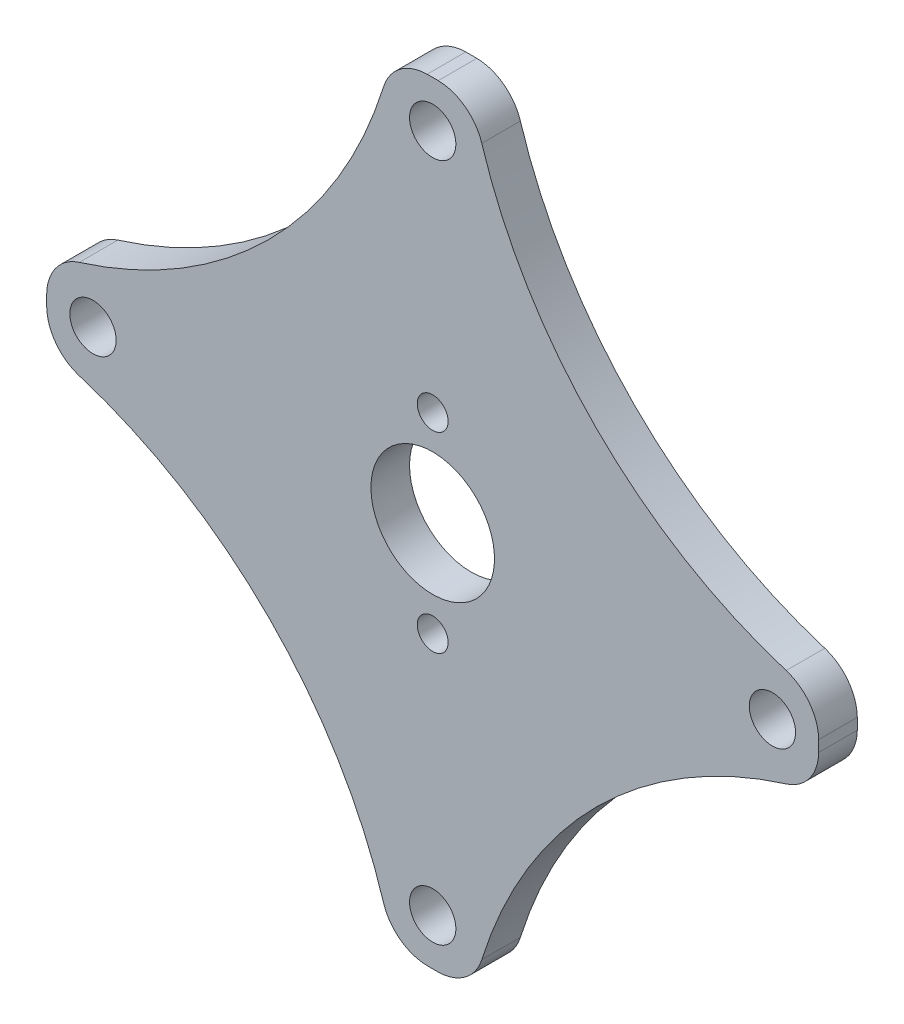
ISO-10303-21;
HEADER;
FILE_DESCRIPTION(('STEP AP214'),'2;1');
FILE_NAME('part.step','',(''),(''),'','','');
FILE_SCHEMA(('AUTOMOTIVE_DESIGN { 1 0 10303 214 1 1 1 1 }'));
ENDSEC;
DATA;
#1=APPLICATION_CONTEXT('core data for automotive mechanical design processes');
#2=APPLICATION_PROTOCOL_DEFINITION('international standard','automotive_design',2000,#1);
#3=PRODUCT_CONTEXT('',#1,'mechanical');
#4=PRODUCT('Part','Part','',(#3));
#5=PRODUCT_RELATED_PRODUCT_CATEGORY('part','',(#4));
#6=PRODUCT_DEFINITION_FORMATION('','',#4);
#7=PRODUCT_DEFINITION_CONTEXT('part definition',#1,'design');
#8=PRODUCT_DEFINITION('design','',#6,#7);
#9=PRODUCT_DEFINITION_SHAPE('','',#8);
#10=(LENGTH_UNIT() NAMED_UNIT(*) SI_UNIT(.MILLI.,.METRE.));
#11=(NAMED_UNIT(*) PLANE_ANGLE_UNIT() SI_UNIT($,.RADIAN.));
#12=(NAMED_UNIT(*) SI_UNIT($,.STERADIAN.) SOLID_ANGLE_UNIT());
#13=UNCERTAINTY_MEASURE_WITH_UNIT(LENGTH_MEASURE(1.E-05),#10,'distance_accuracy_value','');
#14=(GEOMETRIC_REPRESENTATION_CONTEXT(3) GLOBAL_UNCERTAINTY_ASSIGNED_CONTEXT((#13)) GLOBAL_UNIT_ASSIGNED_CONTEXT((#10,
#11,#12)) REPRESENTATION_CONTEXT('',''));
#15=CARTESIAN_POINT('',(0.,0.,0.));
#16=DIRECTION('',(0.,0.,1.));
#17=DIRECTION('',(1.,0.,0.));
#18=AXIS2_PLACEMENT_3D('',#15,#16,#17);
#19=CARTESIAN_POINT('',(0.,0.,2.5));
#20=DIRECTION('',(0.,0.,-1.));
#21=DIRECTION('',(-1.,0.,0.));
#22=AXIS2_PLACEMENT_3D('',#19,#20,#21);
#23=CYLINDRICAL_SURFACE('',#22,25.);
#24=CARTESIAN_POINT('',(0.,0.,2.5));
#25=DIRECTION('',(0.,0.,1.));
#26=DIRECTION('',(1.,0.,0.));
#27=AXIS2_PLACEMENT_3D('',#24,#25,#26);
#28=CIRCLE('',#27,25.);
#29=CARTESIAN_POINT('',(0.358418634758282,24.9974305896078,2.5));
#30=VERTEX_POINT('',#29);
#31=CARTESIAN_POINT('',(-0.358418634758457,24.9974305896078,2.5));
#32=VERTEX_POINT('',#31);
#33=EDGE_CURVE('E185',#30,#32,#28,.T.);
#34=ORIENTED_EDGE('',*,*,#33,.F.);
#35=DIRECTION('',(0.,0.,-1.));
#36=VECTOR('',#35,1.);
#37=CARTESIAN_POINT('',(0.358418634758282,24.9974305896078,2.5));
#38=LINE('',#37,#36);
#39=CARTESIAN_POINT('',(0.358418634758282,24.9974305896078,0.));
#40=VERTEX_POINT('',#39);
#41=EDGE_CURVE('E168',#30,#40,#38,.T.);
#42=ORIENTED_EDGE('',*,*,#41,.T.);
#43=CARTESIAN_POINT('',(0.,0.,0.));
#44=DIRECTION('',(0.,0.,1.));
#45=DIRECTION('',(1.,0.,0.));
#46=AXIS2_PLACEMENT_3D('',#43,#44,#45);
#47=CIRCLE('',#46,25.);
#48=CARTESIAN_POINT('',(-0.358418634758457,24.9974305896078,0.));
#49=VERTEX_POINT('',#48);
#50=EDGE_CURVE('E182',#40,#49,#47,.T.);
#51=ORIENTED_EDGE('',*,*,#50,.T.);
#52=DIRECTION('',(0.,0.,-1.));
#53=VECTOR('',#52,1.);
#54=CARTESIAN_POINT('',(-0.358418634758457,24.9974305896078,2.5));
#55=LINE('',#54,#53);
#56=EDGE_CURVE('E188',#49,#32,#55,.F.);
#57=ORIENTED_EDGE('',*,*,#56,.T.);
#58=EDGE_LOOP('',(#34,#42,#51,#57));
#59=FACE_BOUND('',#58,.T.);
#60=ADVANCED_FACE('F47',(#59),#23,.T.);
#61=CARTESIAN_POINT('',(-24.9974305896078,0.358418634758189,2.5));
#62=VERTEX_POINT('',#61);
#63=CARTESIAN_POINT('',(-24.9974305896078,-0.358418634758548,2.5));
#64=VERTEX_POINT('',#63);
#65=EDGE_CURVE('E381',#62,#64,#28,.T.);
#66=ORIENTED_EDGE('',*,*,#65,.F.);
#67=DIRECTION('',(0.,0.,-1.));
#68=VECTOR('',#67,1.);
#69=CARTESIAN_POINT('',(-24.9974305896078,0.358418634758189,2.5));
#70=LINE('',#69,#68);
#71=CARTESIAN_POINT('',(-24.9974305896078,0.358418634758189,0.));
#72=VERTEX_POINT('',#71);
#73=EDGE_CURVE('E363',#62,#72,#70,.T.);
#74=ORIENTED_EDGE('',*,*,#73,.T.);
#75=CARTESIAN_POINT('',(-24.9974305896078,-0.358418634758548,0.));
#76=VERTEX_POINT('',#75);
#77=EDGE_CURVE('E196',#72,#76,#47,.T.);
#78=ORIENTED_EDGE('',*,*,#77,.T.);
#79=DIRECTION('',(0.,0.,-1.));
#80=VECTOR('',#79,1.);
#81=CARTESIAN_POINT('',(-24.9974305896078,-0.358418634758548,2.5));
#82=LINE('',#81,#80);
#83=EDGE_CURVE('E359',#76,#64,#82,.F.);
#84=ORIENTED_EDGE('',*,*,#83,.T.);
#85=EDGE_LOOP('',(#66,#74,#78,#84));
#86=FACE_BOUND('',#85,.T.);
#87=ADVANCED_FACE('F418',(#86),#23,.T.);
#88=CARTESIAN_POINT('',(-0.358418634758112,-24.9974305896078,2.5));
#89=VERTEX_POINT('',#88);
#90=CARTESIAN_POINT('',(0.358418634758633,-24.9974305896078,2.5));
#91=VERTEX_POINT('',#90);
#92=EDGE_CURVE('E201',#89,#91,#28,.T.);
#93=ORIENTED_EDGE('',*,*,#92,.F.);
#94=DIRECTION('',(0.,0.,-1.));
#95=VECTOR('',#94,1.);
#96=CARTESIAN_POINT('',(-0.358418634758112,-24.9974305896078,2.5));
#97=LINE('',#96,#95);
#98=CARTESIAN_POINT('',(-0.358418634758112,-24.9974305896078,0.));
#99=VERTEX_POINT('',#98);
#100=EDGE_CURVE('E309',#89,#99,#97,.T.);
#101=ORIENTED_EDGE('',*,*,#100,.T.);
#102=CARTESIAN_POINT('',(0.358418634758633,-24.9974305896078,0.));
#103=VERTEX_POINT('',#102);
#104=EDGE_CURVE('E198',#99,#103,#47,.T.);
#105=ORIENTED_EDGE('',*,*,#104,.T.);
#106=DIRECTION('',(0.,0.,-1.));
#107=VECTOR('',#106,1.);
#108=CARTESIAN_POINT('',(0.358418634758633,-24.9974305896078,2.5));
#109=LINE('',#108,#107);
#110=EDGE_CURVE('E314',#103,#91,#109,.F.);
#111=ORIENTED_EDGE('',*,*,#110,.T.);
#112=EDGE_LOOP('',(#93,#101,#105,#111));
#113=FACE_BOUND('',#112,.T.);
#114=ADVANCED_FACE('F375',(#113),#23,.T.);
#115=CARTESIAN_POINT('',(0.,0.,2.5));
#116=DIRECTION('',(0.,0.,1.));
#117=DIRECTION('',(1.,0.,0.));
#118=AXIS2_PLACEMENT_3D('',#115,#116,#117);
#119=PLANE('',#118);
#120=CARTESIAN_POINT('',(31.8198051533946,31.8198051533947,2.5));
#121=DIRECTION('',(0.,0.,1.));
#122=DIRECTION('',(1.,0.,0.));
#123=AXIS2_PLACEMENT_3D('',#120,#121,#122);
#124=CIRCLE('',#123,30.);
#125=CARTESIAN_POINT('',(3.17944446720614,22.8906540310857,2.5));
#126=VERTEX_POINT('',#125);
#127=CARTESIAN_POINT('',(22.8906540310857,3.17944446720621,2.5));
#128=VERTEX_POINT('',#127);
#129=EDGE_CURVE('E278',#126,#128,#124,.T.);
#130=ORIENTED_EDGE('',*,*,#129,.F.);
#131=CARTESIAN_POINT('',(0.315408398587288,21.9977389188548,2.5));
#132=DIRECTION('',(0.,0.,1.));
#133=DIRECTION('',(1.,0.,0.));
#134=AXIS2_PLACEMENT_3D('',#131,#132,#133);
#135=CIRCLE('',#134,3.);
#136=EDGE_CURVE('E350',#126,#30,#135,.T.);
#137=ORIENTED_EDGE('',*,*,#136,.T.);
#138=ORIENTED_EDGE('',*,*,#33,.T.);
#139=CARTESIAN_POINT('',(-0.315408398587442,21.9977389188548,2.5));
#140=DIRECTION('',(0.,0.,1.));
#141=DIRECTION('',(1.,0.,0.));
#142=AXIS2_PLACEMENT_3D('',#139,#140,#141);
#143=CIRCLE('',#142,3.);
#144=CARTESIAN_POINT('',(-3.17944446720629,22.8906540310857,2.5));
#145=VERTEX_POINT('',#144);
#146=EDGE_CURVE('E347',#32,#145,#143,.T.);
#147=ORIENTED_EDGE('',*,*,#146,.T.);
#148=CARTESIAN_POINT('',(-31.8198051533948,31.8198051533945,2.5));
#149=DIRECTION('',(0.,0.,1.));
#150=DIRECTION('',(1.,0.,0.));
#151=AXIS2_PLACEMENT_3D('',#148,#149,#150);
#152=CIRCLE('',#151,30.);
#153=CARTESIAN_POINT('',(-22.8906540310857,3.17944446720605,2.5));
#154=VERTEX_POINT('',#153);
#155=EDGE_CURVE('E258',#154,#145,#152,.T.);
#156=ORIENTED_EDGE('',*,*,#155,.F.);
#157=CARTESIAN_POINT('',(-21.9977389188548,0.315408398587206,2.5));
#158=DIRECTION('',(0.,0.,1.));
#159=DIRECTION('',(1.,0.,0.));
#160=AXIS2_PLACEMENT_3D('',#157,#158,#159);
#161=CIRCLE('',#160,3.);
#162=EDGE_CURVE('E344',#154,#62,#161,.T.);
#163=ORIENTED_EDGE('',*,*,#162,.T.);
#164=ORIENTED_EDGE('',*,*,#65,.T.);
#165=CARTESIAN_POINT('',(-21.9977389188548,-0.315408398587522,2.5));
#166=DIRECTION('',(0.,0.,1.));
#167=DIRECTION('',(1.,0.,0.));
#168=AXIS2_PLACEMENT_3D('',#165,#166,#167);
#169=CIRCLE('',#168,3.);
#170=CARTESIAN_POINT('',(-22.8906540310857,-3.17944446720637,2.5));
#171=VERTEX_POINT('',#170);
#172=EDGE_CURVE('E341',#64,#171,#169,.T.);
#173=ORIENTED_EDGE('',*,*,#172,.T.);
#174=CARTESIAN_POINT('',(-31.8198051533944,-31.8198051533949,2.5));
#175=DIRECTION('',(0.,0.,1.));
#176=DIRECTION('',(1.,0.,0.));
#177=AXIS2_PLACEMENT_3D('',#174,#175,#176);
#178=CIRCLE('',#177,30.);
#179=CARTESIAN_POINT('',(-3.17944446720598,-22.8906540310857,2.5));
#180=VERTEX_POINT('',#179);
#181=EDGE_CURVE('E270',#180,#171,#178,.T.);
#182=ORIENTED_EDGE('',*,*,#181,.F.);
#183=CARTESIAN_POINT('',(-0.315408398587139,-21.9977389188548,2.5));
#184=DIRECTION('',(0.,0.,1.));
#185=DIRECTION('',(1.,0.,0.));
#186=AXIS2_PLACEMENT_3D('',#183,#184,#185);
#187=CIRCLE('',#186,3.);
#188=EDGE_CURVE('E338',#180,#89,#187,.T.);
#189=ORIENTED_EDGE('',*,*,#188,.T.);
#190=ORIENTED_EDGE('',*,*,#92,.T.);
#191=CARTESIAN_POINT('',(0.315408398587597,-21.9977389188548,2.5));
#192=DIRECTION('',(0.,0.,1.));
#193=DIRECTION('',(1.,0.,0.));
#194=AXIS2_PLACEMENT_3D('',#191,#192,#193);
#195=CIRCLE('',#194,3.);
#196=CARTESIAN_POINT('',(3.17944446720645,-22.8906540310857,2.5));
#197=VERTEX_POINT('',#196);
#198=EDGE_CURVE('E335',#91,#197,#195,.T.);
#199=ORIENTED_EDGE('',*,*,#198,.T.);
#200=CARTESIAN_POINT('',(31.819805153395,-31.8198051533942,2.5));
#201=DIRECTION('',(0.,0.,1.));
#202=DIRECTION('',(1.,0.,0.));
#203=AXIS2_PLACEMENT_3D('',#200,#201,#202);
#204=CIRCLE('',#203,30.);
#205=CARTESIAN_POINT('',(22.8906540310858,-3.17944446720589,2.5));
#206=VERTEX_POINT('',#205);
#207=EDGE_CURVE('E274',#206,#197,#204,.T.);
#208=ORIENTED_EDGE('',*,*,#207,.F.);
#209=CARTESIAN_POINT('',(21.9977389188548,-0.315408398587054,2.5));
#210=DIRECTION('',(0.,0.,1.));
#211=DIRECTION('',(1.,0.,0.));
#212=AXIS2_PLACEMENT_3D('',#209,#210,#211);
#213=CIRCLE('',#212,3.);
#214=CARTESIAN_POINT('',(24.9974305896078,-0.358418634758015,2.5));
#215=VERTEX_POINT('',#214);
#216=EDGE_CURVE('E71',#206,#215,#213,.T.);
#217=ORIENTED_EDGE('',*,*,#216,.T.);
#218=CARTESIAN_POINT('',(24.9974305896078,0.358418634758364,2.5));
#219=VERTEX_POINT('',#218);
#220=EDGE_CURVE('E195',#215,#219,#28,.T.);
#221=ORIENTED_EDGE('',*,*,#220,.T.);
#222=CARTESIAN_POINT('',(21.9977389188548,0.315408398587361,2.5));
#223=DIRECTION('',(0.,0.,1.));
#224=DIRECTION('',(1.,0.,0.));
#225=AXIS2_PLACEMENT_3D('',#222,#223,#224);
#226=CIRCLE('',#225,3.);
#227=EDGE_CURVE('E63',#219,#128,#226,.T.);
#228=ORIENTED_EDGE('',*,*,#227,.T.);
#229=EDGE_LOOP('',(#130,#137,#138,#147,#156,#163,#164,#173,#182,#189,#190,#199,#208,#217,#221,#228));
#230=FACE_BOUND('',#229,.T.);
#231=CARTESIAN_POINT('',(0.,6.2,2.5));
#232=DIRECTION('',(0.,0.,-1.));
#233=DIRECTION('',(-1.,0.,0.));
#234=AXIS2_PLACEMENT_3D('',#231,#232,#233);
#235=CIRCLE('',#234,1.);
#236=CARTESIAN_POINT('',(-1.,6.2,2.5));
#237=VERTEX_POINT('',#236);
#238=EDGE_CURVE('E262',#237,#237,#235,.T.);
#239=ORIENTED_EDGE('',*,*,#238,.T.);
#240=EDGE_LOOP('',(#239));
#241=FACE_BOUND('',#240,.T.);
#242=CARTESIAN_POINT('',(0.,0.,2.5));
#243=DIRECTION('',(0.,0.,-1.));
#244=DIRECTION('',(-1.,0.,0.));
#245=AXIS2_PLACEMENT_3D('',#242,#243,#244);
#246=CIRCLE('',#245,4.);
#247=CARTESIAN_POINT('',(-4.,0.,2.5));
#248=VERTEX_POINT('',#247);
#249=EDGE_CURVE('E257',#248,#248,#246,.T.);
#250=ORIENTED_EDGE('',*,*,#249,.T.);
#251=EDGE_LOOP('',(#250));
#252=FACE_BOUND('',#251,.T.);
#253=CARTESIAN_POINT('',(0.,-6.2,2.5));
#254=DIRECTION('',(0.,0.,-1.));
#255=DIRECTION('',(-1.,0.,0.));
#256=AXIS2_PLACEMENT_3D('',#253,#254,#255);
#257=CIRCLE('',#256,1.);
#258=CARTESIAN_POINT('',(-1.,-6.2,2.5));
#259=VERTEX_POINT('',#258);
#260=EDGE_CURVE('E253',#259,#259,#257,.T.);
#261=ORIENTED_EDGE('',*,*,#260,.T.);
#262=EDGE_LOOP('',(#261));
#263=FACE_BOUND('',#262,.T.);
#264=CARTESIAN_POINT('',(22.,-2.26077837006677E-12,2.5));
#265=DIRECTION('',(0.,0.,1.));
#266=DIRECTION('',(1.,0.,0.));
#267=AXIS2_PLACEMENT_3D('',#264,#265,#266);
#268=CIRCLE('',#267,1.5);
#269=CARTESIAN_POINT('',(23.5,-2.26077837006677E-12,2.5));
#270=VERTEX_POINT('',#269);
#271=EDGE_CURVE('E233',#270,#270,#268,.T.);
#272=ORIENTED_EDGE('',*,*,#271,.F.);
#273=EDGE_LOOP('',(#272));
#274=FACE_BOUND('',#273,.T.);
#275=CARTESIAN_POINT('',(0.,22.,2.5));
#276=DIRECTION('',(0.,0.,1.));
#277=DIRECTION('',(1.,0.,0.));
#278=AXIS2_PLACEMENT_3D('',#275,#276,#277);
#279=CIRCLE('',#278,1.5);
#280=CARTESIAN_POINT('',(1.5,22.,2.5));
#281=VERTEX_POINT('',#280);
#282=EDGE_CURVE('E215',#281,#281,#279,.T.);
#283=ORIENTED_EDGE('',*,*,#282,.F.);
#284=EDGE_LOOP('',(#283));
#285=FACE_BOUND('',#284,.T.);
#286=CARTESIAN_POINT('',(-22.,-2.25991100832879E-12,2.5));
#287=DIRECTION('',(0.,0.,1.));
#288=DIRECTION('',(-1.,0.,0.));
#289=AXIS2_PLACEMENT_3D('',#286,#287,#288);
#290=CIRCLE('',#289,1.5);
#291=CARTESIAN_POINT('',(-23.5,-2.25991100832879E-12,2.5));
#292=VERTEX_POINT('',#291);
#293=EDGE_CURVE('E226',#292,#292,#290,.T.);
#294=ORIENTED_EDGE('',*,*,#293,.F.);
#295=EDGE_LOOP('',(#294));
#296=FACE_BOUND('',#295,.T.);
#297=CARTESIAN_POINT('',(-4.52068937839556E-12,-22.,2.5));
#298=DIRECTION('',(0.,0.,1.));
#299=DIRECTION('',(1.,0.,0.));
#300=AXIS2_PLACEMENT_3D('',#297,#298,#299);
#301=CIRCLE('',#300,1.5);
#302=CARTESIAN_POINT('',(1.49999999999548,-22.,2.5));
#303=VERTEX_POINT('',#302);
#304=EDGE_CURVE('E241',#303,#303,#301,.T.);
#305=ORIENTED_EDGE('',*,*,#304,.F.);
#306=EDGE_LOOP('',(#305));
#307=FACE_BOUND('',#306,.T.);
#308=ADVANCED_FACE('F321',(#230,#241,#252,#263,#274,#285,#296,#307),#119,.T.);
#309=CARTESIAN_POINT('',(0.,0.,0.));
#310=DIRECTION('',(0.,0.,1.));
#311=DIRECTION('',(1.,0.,0.));
#312=AXIS2_PLACEMENT_3D('',#309,#310,#311);
#313=PLANE('',#312);
#314=CARTESIAN_POINT('',(0.,6.2,0.));
#315=DIRECTION('',(0.,0.,1.));
#316=DIRECTION('',(1.,0.,0.));
#317=AXIS2_PLACEMENT_3D('',#314,#315,#316);
#318=CIRCLE('',#317,1.);
#319=CARTESIAN_POINT('',(1.,6.2,0.));
#320=VERTEX_POINT('',#319);
#321=EDGE_CURVE('E249',#320,#320,#318,.T.);
#322=ORIENTED_EDGE('',*,*,#321,.T.);
#323=EDGE_LOOP('',(#322));
#324=FACE_BOUND('',#323,.T.);
#325=CARTESIAN_POINT('',(0.,0.,0.));
#326=DIRECTION('',(0.,0.,1.));
#327=DIRECTION('',(1.,0.,0.));
#328=AXIS2_PLACEMENT_3D('',#325,#326,#327);
#329=CIRCLE('',#328,4.);
#330=CARTESIAN_POINT('',(4.,0.,0.));
#331=VERTEX_POINT('',#330);
#332=EDGE_CURVE('E647',#331,#331,#329,.T.);
#333=ORIENTED_EDGE('',*,*,#332,.T.);
#334=EDGE_LOOP('',(#333));
#335=FACE_BOUND('',#334,.T.);
#336=CARTESIAN_POINT('',(0.,-6.2,0.));
#337=DIRECTION('',(0.,0.,1.));
#338=DIRECTION('',(1.,0.,0.));
#339=AXIS2_PLACEMENT_3D('',#336,#337,#338);
#340=CIRCLE('',#339,1.);
#341=CARTESIAN_POINT('',(1.,-6.2,0.));
#342=VERTEX_POINT('',#341);
#343=EDGE_CURVE('E266',#342,#342,#340,.T.);
#344=ORIENTED_EDGE('',*,*,#343,.T.);
#345=EDGE_LOOP('',(#344));
#346=FACE_BOUND('',#345,.T.);
#347=ORIENTED_EDGE('',*,*,#50,.F.);
#348=CARTESIAN_POINT('',(0.315408398587288,21.9977389188548,0.));
#349=DIRECTION('',(0.,0.,1.));
#350=DIRECTION('',(1.,0.,0.));
#351=AXIS2_PLACEMENT_3D('',#348,#349,#350);
#352=CIRCLE('',#351,3.);
#353=CARTESIAN_POINT('',(3.17944446720614,22.8906540310857,0.));
#354=VERTEX_POINT('',#353);
#355=EDGE_CURVE('E164',#40,#354,#352,.F.);
#356=ORIENTED_EDGE('',*,*,#355,.T.);
#357=CARTESIAN_POINT('',(31.8198051533946,31.8198051533947,0.));
#358=DIRECTION('',(0.,0.,-1.));
#359=DIRECTION('',(-1.,0.,0.));
#360=AXIS2_PLACEMENT_3D('',#357,#358,#359);
#361=CIRCLE('',#360,30.);
#362=CARTESIAN_POINT('',(22.8906540310857,3.17944446720621,0.));
#363=VERTEX_POINT('',#362);
#364=EDGE_CURVE('E282',#363,#354,#361,.T.);
#365=ORIENTED_EDGE('',*,*,#364,.F.);
#366=CARTESIAN_POINT('',(21.9977389188548,0.315408398587361,0.));
#367=DIRECTION('',(0.,0.,1.));
#368=DIRECTION('',(1.,0.,0.));
#369=AXIS2_PLACEMENT_3D('',#366,#367,#368);
#370=CIRCLE('',#369,3.);
#371=CARTESIAN_POINT('',(24.9974305896078,0.358418634758364,0.));
#372=VERTEX_POINT('',#371);
#373=EDGE_CURVE('E187',#363,#372,#370,.F.);
#374=ORIENTED_EDGE('',*,*,#373,.T.);
#375=CARTESIAN_POINT('',(24.9974305896078,-0.358418634758015,0.));
#376=VERTEX_POINT('',#375);
#377=EDGE_CURVE('E204',#376,#372,#47,.T.);
#378=ORIENTED_EDGE('',*,*,#377,.F.);
#379=CARTESIAN_POINT('',(21.9977389188548,-0.315408398587054,0.));
#380=DIRECTION('',(0.,0.,1.));
#381=DIRECTION('',(1.,0.,0.));
#382=AXIS2_PLACEMENT_3D('',#379,#380,#381);
#383=CIRCLE('',#382,3.);
#384=CARTESIAN_POINT('',(22.8906540310858,-3.17944446720589,0.));
#385=VERTEX_POINT('',#384);
#386=EDGE_CURVE('E307',#376,#385,#383,.F.);
#387=ORIENTED_EDGE('',*,*,#386,.T.);
#388=CARTESIAN_POINT('',(31.819805153395,-31.8198051533942,0.));
#389=DIRECTION('',(0.,0.,-1.));
#390=DIRECTION('',(-1.,0.,0.));
#391=AXIS2_PLACEMENT_3D('',#388,#389,#390);
#392=CIRCLE('',#391,30.);
#393=CARTESIAN_POINT('',(3.17944446720645,-22.8906540310857,0.));
#394=VERTEX_POINT('',#393);
#395=EDGE_CURVE('E285',#394,#385,#392,.T.);
#396=ORIENTED_EDGE('',*,*,#395,.F.);
#397=CARTESIAN_POINT('',(0.315408398587597,-21.9977389188548,0.));
#398=DIRECTION('',(0.,0.,1.));
#399=DIRECTION('',(1.,0.,0.));
#400=AXIS2_PLACEMENT_3D('',#397,#398,#399);
#401=CIRCLE('',#400,3.);
#402=EDGE_CURVE('E395',#394,#103,#401,.F.);
#403=ORIENTED_EDGE('',*,*,#402,.T.);
#404=ORIENTED_EDGE('',*,*,#104,.F.);
#405=CARTESIAN_POINT('',(-0.315408398587139,-21.9977389188548,0.));
#406=DIRECTION('',(0.,0.,1.));
#407=DIRECTION('',(1.,0.,0.));
#408=AXIS2_PLACEMENT_3D('',#405,#406,#407);
#409=CIRCLE('',#408,3.);
#410=CARTESIAN_POINT('',(-3.17944446720598,-22.8906540310857,0.));
#411=VERTEX_POINT('',#410);
#412=EDGE_CURVE('E398',#99,#411,#409,.F.);
#413=ORIENTED_EDGE('',*,*,#412,.T.);
#414=CARTESIAN_POINT('',(-31.8198051533944,-31.8198051533949,0.));
#415=DIRECTION('',(0.,0.,-1.));
#416=DIRECTION('',(-1.,0.,0.));
#417=AXIS2_PLACEMENT_3D('',#414,#415,#416);
#418=CIRCLE('',#417,30.);
#419=CARTESIAN_POINT('',(-22.8906540310857,-3.17944446720637,0.));
#420=VERTEX_POINT('',#419);
#421=EDGE_CURVE('E290',#420,#411,#418,.T.);
#422=ORIENTED_EDGE('',*,*,#421,.F.);
#423=CARTESIAN_POINT('',(-21.9977389188548,-0.315408398587522,0.));
#424=DIRECTION('',(0.,0.,1.));
#425=DIRECTION('',(1.,0.,0.));
#426=AXIS2_PLACEMENT_3D('',#423,#424,#425);
#427=CIRCLE('',#426,3.);
#428=EDGE_CURVE('E401',#420,#76,#427,.F.);
#429=ORIENTED_EDGE('',*,*,#428,.T.);
#430=ORIENTED_EDGE('',*,*,#77,.F.);
#431=CARTESIAN_POINT('',(-21.9977389188548,0.315408398587206,0.));
#432=DIRECTION('',(0.,0.,1.));
#433=DIRECTION('',(1.,0.,0.));
#434=AXIS2_PLACEMENT_3D('',#431,#432,#433);
#435=CIRCLE('',#434,3.);
#436=CARTESIAN_POINT('',(-22.8906540310857,3.17944446720605,0.));
#437=VERTEX_POINT('',#436);
#438=EDGE_CURVE('E404',#72,#437,#435,.F.);
#439=ORIENTED_EDGE('',*,*,#438,.T.);
#440=CARTESIAN_POINT('',(-31.8198051533948,31.8198051533945,0.));
#441=DIRECTION('',(0.,0.,-1.));
#442=DIRECTION('',(-1.,0.,0.));
#443=AXIS2_PLACEMENT_3D('',#440,#441,#442);
#444=CIRCLE('',#443,30.);
#445=CARTESIAN_POINT('',(-3.17944446720629,22.8906540310857,0.));
#446=VERTEX_POINT('',#445);
#447=EDGE_CURVE('E286',#446,#437,#444,.T.);
#448=ORIENTED_EDGE('',*,*,#447,.F.);
#449=CARTESIAN_POINT('',(-0.315408398587442,21.9977389188548,0.));
#450=DIRECTION('',(0.,0.,1.));
#451=DIRECTION('',(1.,0.,0.));
#452=AXIS2_PLACEMENT_3D('',#449,#450,#451);
#453=CIRCLE('',#452,3.);
#454=EDGE_CURVE('E176',#446,#49,#453,.F.);
#455=ORIENTED_EDGE('',*,*,#454,.T.);
#456=EDGE_LOOP('',(#347,#356,#365,#374,#378,#387,#396,#403,#404,#413,#422,#429,#430,#439,#448,#455));
#457=FACE_BOUND('',#456,.T.);
#458=CARTESIAN_POINT('',(0.,22.,0.));
#459=DIRECTION('',(0.,0.,1.));
#460=DIRECTION('',(1.,0.,0.));
#461=AXIS2_PLACEMENT_3D('',#458,#459,#460);
#462=CIRCLE('',#461,1.5);
#463=CARTESIAN_POINT('',(1.5,22.,0.));
#464=VERTEX_POINT('',#463);
#465=EDGE_CURVE('E220',#464,#464,#462,.T.);
#466=ORIENTED_EDGE('',*,*,#465,.T.);
#467=EDGE_LOOP('',(#466));
#468=FACE_BOUND('',#467,.T.);
#469=CARTESIAN_POINT('',(-22.,-2.25991100832879E-12,0.));
#470=DIRECTION('',(0.,0.,1.));
#471=DIRECTION('',(-1.,0.,0.));
#472=AXIS2_PLACEMENT_3D('',#469,#470,#471);
#473=CIRCLE('',#472,1.5);
#474=CARTESIAN_POINT('',(-23.5,-2.25991100832879E-12,0.));
#475=VERTEX_POINT('',#474);
#476=EDGE_CURVE('E229',#475,#475,#473,.T.);
#477=ORIENTED_EDGE('',*,*,#476,.T.);
#478=EDGE_LOOP('',(#477));
#479=FACE_BOUND('',#478,.T.);
#480=CARTESIAN_POINT('',(22.,-2.26077837006677E-12,0.));
#481=DIRECTION('',(0.,0.,1.));
#482=DIRECTION('',(1.,0.,0.));
#483=AXIS2_PLACEMENT_3D('',#480,#481,#482);
#484=CIRCLE('',#483,1.5);
#485=CARTESIAN_POINT('',(23.5,-2.26077837006677E-12,0.));
#486=VERTEX_POINT('',#485);
#487=EDGE_CURVE('E237',#486,#486,#484,.T.);
#488=ORIENTED_EDGE('',*,*,#487,.T.);
#489=EDGE_LOOP('',(#488));
#490=FACE_BOUND('',#489,.T.);
#491=CARTESIAN_POINT('',(-4.52068937839556E-12,-22.,0.));
#492=DIRECTION('',(0.,0.,1.));
#493=DIRECTION('',(1.,0.,0.));
#494=AXIS2_PLACEMENT_3D('',#491,#492,#493);
#495=CIRCLE('',#494,1.5);
#496=CARTESIAN_POINT('',(1.49999999999548,-22.,0.));
#497=VERTEX_POINT('',#496);
#498=EDGE_CURVE('E245',#497,#497,#495,.T.);
#499=ORIENTED_EDGE('',*,*,#498,.T.);
#500=EDGE_LOOP('',(#499));
#501=FACE_BOUND('',#500,.T.);
#502=ADVANCED_FACE('F190',(#324,#335,#346,#457,#468,#479,#490,#501),#313,.F.);
#503=ORIENTED_EDGE('',*,*,#220,.F.);
#504=DIRECTION('',(0.,0.,-1.));
#505=VECTOR('',#504,1.);
#506=CARTESIAN_POINT('',(24.9974305896078,-0.358418634758015,2.5));
#507=LINE('',#506,#505);
#508=EDGE_CURVE('E11',#215,#376,#507,.T.);
#509=ORIENTED_EDGE('',*,*,#508,.T.);
#510=ORIENTED_EDGE('',*,*,#377,.T.);
#511=DIRECTION('',(0.,0.,-1.));
#512=VECTOR('',#511,1.);
#513=CARTESIAN_POINT('',(24.9974305896078,0.358418634758364,2.5));
#514=LINE('',#513,#512);
#515=EDGE_CURVE('E56',#372,#219,#514,.F.);
#516=ORIENTED_EDGE('',*,*,#515,.T.);
#517=EDGE_LOOP('',(#503,#509,#510,#516));
#518=FACE_BOUND('',#517,.T.);
#519=ADVANCED_FACE('F318',(#518),#23,.T.);
#520=CARTESIAN_POINT('',(0.,22.,2.5));
#521=DIRECTION('',(0.,0.,-1.));
#522=DIRECTION('',(-1.,0.,0.));
#523=AXIS2_PLACEMENT_3D('',#520,#521,#522);
#524=CYLINDRICAL_SURFACE('',#523,1.5);
#525=ORIENTED_EDGE('',*,*,#282,.T.);
#526=EDGE_LOOP('',(#525));
#527=FACE_BOUND('',#526,.T.);
#528=ORIENTED_EDGE('',*,*,#465,.F.);
#529=EDGE_LOOP('',(#528));
#530=FACE_BOUND('',#529,.T.);
#531=ADVANCED_FACE('F447',(#527,#530),#524,.F.);
#532=CARTESIAN_POINT('',(-22.,-2.25991100832879E-12,2.5));
#533=DIRECTION('',(0.,0.,-1.));
#534=DIRECTION('',(-1.,0.,0.));
#535=AXIS2_PLACEMENT_3D('',#532,#533,#534);
#536=CYLINDRICAL_SURFACE('',#535,1.5);
#537=ORIENTED_EDGE('',*,*,#293,.T.);
#538=EDGE_LOOP('',(#537));
#539=FACE_BOUND('',#538,.T.);
#540=ORIENTED_EDGE('',*,*,#476,.F.);
#541=EDGE_LOOP('',(#540));
#542=FACE_BOUND('',#541,.T.);
#543=ADVANCED_FACE('F453',(#539,#542),#536,.F.);
#544=CARTESIAN_POINT('',(22.,-2.26077837006677E-12,2.5));
#545=DIRECTION('',(0.,0.,-1.));
#546=DIRECTION('',(-1.,0.,0.));
#547=AXIS2_PLACEMENT_3D('',#544,#545,#546);
#548=CYLINDRICAL_SURFACE('',#547,1.5);
#549=ORIENTED_EDGE('',*,*,#271,.T.);
#550=EDGE_LOOP('',(#549));
#551=FACE_BOUND('',#550,.T.);
#552=ORIENTED_EDGE('',*,*,#487,.F.);
#553=EDGE_LOOP('',(#552));
#554=FACE_BOUND('',#553,.T.);
#555=ADVANCED_FACE('F466',(#551,#554),#548,.F.);
#556=CARTESIAN_POINT('',(-4.52068937839556E-12,-22.,2.5));
#557=DIRECTION('',(0.,0.,-1.));
#558=DIRECTION('',(-1.,0.,0.));
#559=AXIS2_PLACEMENT_3D('',#556,#557,#558);
#560=CYLINDRICAL_SURFACE('',#559,1.5);
#561=ORIENTED_EDGE('',*,*,#304,.T.);
#562=EDGE_LOOP('',(#561));
#563=FACE_BOUND('',#562,.T.);
#564=ORIENTED_EDGE('',*,*,#498,.F.);
#565=EDGE_LOOP('',(#564));
#566=FACE_BOUND('',#565,.T.);
#567=ADVANCED_FACE('F470',(#563,#566),#560,.F.);
#568=CARTESIAN_POINT('',(0.,-6.2,2.5));
#569=DIRECTION('',(0.,0.,-1.));
#570=DIRECTION('',(-1.,0.,0.));
#571=AXIS2_PLACEMENT_3D('',#568,#569,#570);
#572=CYLINDRICAL_SURFACE('',#571,1.);
#573=ORIENTED_EDGE('',*,*,#260,.F.);
#574=EDGE_LOOP('',(#573));
#575=FACE_BOUND('',#574,.T.);
#576=ORIENTED_EDGE('',*,*,#343,.F.);
#577=EDGE_LOOP('',(#576));
#578=FACE_BOUND('',#577,.T.);
#579=ADVANCED_FACE('F474',(#575,#578),#572,.F.);
#580=CARTESIAN_POINT('',(0.,0.,2.5));
#581=DIRECTION('',(0.,0.,-1.));
#582=DIRECTION('',(-1.,0.,0.));
#583=AXIS2_PLACEMENT_3D('',#580,#581,#582);
#584=CYLINDRICAL_SURFACE('',#583,4.);
#585=ORIENTED_EDGE('',*,*,#249,.F.);
#586=EDGE_LOOP('',(#585));
#587=FACE_BOUND('',#586,.T.);
#588=ORIENTED_EDGE('',*,*,#332,.F.);
#589=EDGE_LOOP('',(#588));
#590=FACE_BOUND('',#589,.T.);
#591=ADVANCED_FACE('F478',(#587,#590),#584,.F.);
#592=CARTESIAN_POINT('',(0.,6.2,2.5));
#593=DIRECTION('',(0.,0.,-1.));
#594=DIRECTION('',(-1.,0.,0.));
#595=AXIS2_PLACEMENT_3D('',#592,#593,#594);
#596=CYLINDRICAL_SURFACE('',#595,1.);
#597=ORIENTED_EDGE('',*,*,#238,.F.);
#598=EDGE_LOOP('',(#597));
#599=FACE_BOUND('',#598,.T.);
#600=ORIENTED_EDGE('',*,*,#321,.F.);
#601=EDGE_LOOP('',(#600));
#602=FACE_BOUND('',#601,.T.);
#603=ADVANCED_FACE('F482',(#599,#602),#596,.F.);
#604=CARTESIAN_POINT('',(31.8198051533946,31.8198051533947,10.));
#605=DIRECTION('',(0.,0.,-1.));
#606=DIRECTION('',(-1.,0.,0.));
#607=AXIS2_PLACEMENT_3D('',#604,#605,#606);
#608=CYLINDRICAL_SURFACE('',#607,30.);
#609=ORIENTED_EDGE('',*,*,#364,.T.);
#610=DIRECTION('',(0.,0.,-1.));
#611=VECTOR('',#610,1.);
#612=CARTESIAN_POINT('',(3.17944446720613,22.8906540310857,10.));
#613=LINE('',#612,#611);
#614=EDGE_CURVE('E169',#354,#126,#613,.F.);
#615=ORIENTED_EDGE('',*,*,#614,.T.);
#616=ORIENTED_EDGE('',*,*,#129,.T.);
#617=DIRECTION('',(0.,0.,-1.));
#618=VECTOR('',#617,1.);
#619=CARTESIAN_POINT('',(22.8906540310857,3.17944446720621,10.));
#620=LINE('',#619,#618);
#621=EDGE_CURVE('E175',#128,#363,#620,.T.);
#622=ORIENTED_EDGE('',*,*,#621,.T.);
#623=EDGE_LOOP('',(#609,#615,#616,#622));
#624=FACE_BOUND('',#623,.T.);
#625=ADVANCED_FACE('F326',(#624),#608,.F.);
#626=CARTESIAN_POINT('',(31.819805153395,-31.8198051533942,10.));
#627=DIRECTION('',(0.,0.,-1.));
#628=DIRECTION('',(-1.,0.,0.));
#629=AXIS2_PLACEMENT_3D('',#626,#627,#628);
#630=CYLINDRICAL_SURFACE('',#629,30.);
#631=ORIENTED_EDGE('',*,*,#207,.T.);
#632=DIRECTION('',(0.,0.,-1.));
#633=VECTOR('',#632,1.);
#634=CARTESIAN_POINT('',(3.17944446720645,-22.8906540310857,10.));
#635=LINE('',#634,#633);
#636=EDGE_CURVE('E302',#197,#394,#635,.T.);
#637=ORIENTED_EDGE('',*,*,#636,.T.);
#638=ORIENTED_EDGE('',*,*,#395,.T.);
#639=DIRECTION('',(0.,0.,-1.));
#640=VECTOR('',#639,1.);
#641=CARTESIAN_POINT('',(22.8906540310858,-3.17944446720589,10.));
#642=LINE('',#641,#640);
#643=EDGE_CURVE('E300',#385,#206,#642,.F.);
#644=ORIENTED_EDGE('',*,*,#643,.T.);
#645=EDGE_LOOP('',(#631,#637,#638,#644));
#646=FACE_BOUND('',#645,.T.);
#647=ADVANCED_FACE('F299',(#646),#630,.F.);
#648=CARTESIAN_POINT('',(-31.8198051533944,-31.8198051533949,10.));
#649=DIRECTION('',(0.,0.,-1.));
#650=DIRECTION('',(-1.,0.,0.));
#651=AXIS2_PLACEMENT_3D('',#648,#649,#650);
#652=CYLINDRICAL_SURFACE('',#651,30.);
#653=ORIENTED_EDGE('',*,*,#181,.T.);
#654=DIRECTION('',(0.,0.,-1.));
#655=VECTOR('',#654,1.);
#656=CARTESIAN_POINT('',(-22.8906540310857,-3.17944446720637,10.));
#657=LINE('',#656,#655);
#658=EDGE_CURVE('E370',#171,#420,#657,.T.);
#659=ORIENTED_EDGE('',*,*,#658,.T.);
#660=ORIENTED_EDGE('',*,*,#421,.T.);
#661=DIRECTION('',(0.,0.,-1.));
#662=VECTOR('',#661,1.);
#663=CARTESIAN_POINT('',(-3.17944446720597,-22.8906540310857,10.));
#664=LINE('',#663,#662);
#665=EDGE_CURVE('E367',#411,#180,#664,.F.);
#666=ORIENTED_EDGE('',*,*,#665,.T.);
#667=EDGE_LOOP('',(#653,#659,#660,#666));
#668=FACE_BOUND('',#667,.T.);
#669=ADVANCED_FACE('F425',(#668),#652,.F.);
#670=CARTESIAN_POINT('',(-31.8198051533948,31.8198051533945,10.));
#671=DIRECTION('',(0.,0.,-1.));
#672=DIRECTION('',(-1.,0.,0.));
#673=AXIS2_PLACEMENT_3D('',#670,#671,#672);
#674=CYLINDRICAL_SURFACE('',#673,30.);
#675=ORIENTED_EDGE('',*,*,#155,.T.);
#676=DIRECTION('',(0.,0.,-1.));
#677=VECTOR('',#676,1.);
#678=CARTESIAN_POINT('',(-3.17944446720629,22.8906540310857,10.));
#679=LINE('',#678,#677);
#680=EDGE_CURVE('E356',#145,#446,#679,.T.);
#681=ORIENTED_EDGE('',*,*,#680,.T.);
#682=ORIENTED_EDGE('',*,*,#447,.T.);
#683=DIRECTION('',(0.,0.,-1.));
#684=VECTOR('',#683,1.);
#685=CARTESIAN_POINT('',(-22.8906540310857,3.17944446720605,10.));
#686=LINE('',#685,#684);
#687=EDGE_CURVE('E353',#437,#154,#686,.F.);
#688=ORIENTED_EDGE('',*,*,#687,.T.);
#689=EDGE_LOOP('',(#675,#681,#682,#688));
#690=FACE_BOUND('',#689,.T.);
#691=ADVANCED_FACE('F412',(#690),#674,.F.);
#692=CARTESIAN_POINT('',(0.315408398587288,21.9977389188548,10.));
#693=DIRECTION('',(0.,0.,1.));
#694=DIRECTION('',(1.,0.,0.));
#695=AXIS2_PLACEMENT_3D('',#692,#693,#694);
#696=CYLINDRICAL_SURFACE('',#695,3.);
#697=ORIENTED_EDGE('',*,*,#136,.F.);
#698=ORIENTED_EDGE('',*,*,#614,.F.);
#699=ORIENTED_EDGE('',*,*,#355,.F.);
#700=ORIENTED_EDGE('',*,*,#41,.F.);
#701=EDGE_LOOP('',(#697,#698,#699,#700));
#702=FACE_BOUND('',#701,.T.);
#703=ADVANCED_FACE('F167',(#702),#696,.T.);
#704=CARTESIAN_POINT('',(-0.315408398587442,21.9977389188548,10.));
#705=DIRECTION('',(0.,0.,-1.));
#706=DIRECTION('',(-1.,0.,0.));
#707=AXIS2_PLACEMENT_3D('',#704,#705,#706);
#708=CYLINDRICAL_SURFACE('',#707,3.);
#709=ORIENTED_EDGE('',*,*,#454,.F.);
#710=ORIENTED_EDGE('',*,*,#680,.F.);
#711=ORIENTED_EDGE('',*,*,#146,.F.);
#712=ORIENTED_EDGE('',*,*,#56,.F.);
#713=EDGE_LOOP('',(#709,#710,#711,#712));
#714=FACE_BOUND('',#713,.T.);
#715=ADVANCED_FACE('F513',(#714),#708,.T.);
#716=CARTESIAN_POINT('',(-21.9977389188548,0.315408398587206,10.));
#717=DIRECTION('',(0.,0.,1.));
#718=DIRECTION('',(1.,0.,0.));
#719=AXIS2_PLACEMENT_3D('',#716,#717,#718);
#720=CYLINDRICAL_SURFACE('',#719,3.);
#721=ORIENTED_EDGE('',*,*,#162,.F.);
#722=ORIENTED_EDGE('',*,*,#687,.F.);
#723=ORIENTED_EDGE('',*,*,#438,.F.);
#724=ORIENTED_EDGE('',*,*,#73,.F.);
#725=EDGE_LOOP('',(#721,#722,#723,#724));
#726=FACE_BOUND('',#725,.T.);
#727=ADVANCED_FACE('F416',(#726),#720,.T.);
#728=CARTESIAN_POINT('',(-21.9977389188548,-0.315408398587522,10.));
#729=DIRECTION('',(0.,0.,-1.));
#730=DIRECTION('',(-1.,0.,0.));
#731=AXIS2_PLACEMENT_3D('',#728,#729,#730);
#732=CYLINDRICAL_SURFACE('',#731,3.);
#733=ORIENTED_EDGE('',*,*,#428,.F.);
#734=ORIENTED_EDGE('',*,*,#658,.F.);
#735=ORIENTED_EDGE('',*,*,#172,.F.);
#736=ORIENTED_EDGE('',*,*,#83,.F.);
#737=EDGE_LOOP('',(#733,#734,#735,#736));
#738=FACE_BOUND('',#737,.T.);
#739=ADVANCED_FACE('F422',(#738),#732,.T.);
#740=CARTESIAN_POINT('',(-0.315408398587139,-21.9977389188548,10.));
#741=DIRECTION('',(0.,0.,1.));
#742=DIRECTION('',(1.,0.,0.));
#743=AXIS2_PLACEMENT_3D('',#740,#741,#742);
#744=CYLINDRICAL_SURFACE('',#743,3.);
#745=ORIENTED_EDGE('',*,*,#188,.F.);
#746=ORIENTED_EDGE('',*,*,#665,.F.);
#747=ORIENTED_EDGE('',*,*,#412,.F.);
#748=ORIENTED_EDGE('',*,*,#100,.F.);
#749=EDGE_LOOP('',(#745,#746,#747,#748));
#750=FACE_BOUND('',#749,.T.);
#751=ADVANCED_FACE('F429',(#750),#744,.T.);
#752=CARTESIAN_POINT('',(0.315408398587597,-21.9977389188548,10.));
#753=DIRECTION('',(0.,0.,-1.));
#754=DIRECTION('',(-1.,0.,0.));
#755=AXIS2_PLACEMENT_3D('',#752,#753,#754);
#756=CYLINDRICAL_SURFACE('',#755,3.);
#757=ORIENTED_EDGE('',*,*,#402,.F.);
#758=ORIENTED_EDGE('',*,*,#636,.F.);
#759=ORIENTED_EDGE('',*,*,#198,.F.);
#760=ORIENTED_EDGE('',*,*,#110,.F.);
#761=EDGE_LOOP('',(#757,#758,#759,#760));
#762=FACE_BOUND('',#761,.T.);
#763=ADVANCED_FACE('F430',(#762),#756,.T.);
#764=CARTESIAN_POINT('',(21.9977389188548,-0.315408398587054,10.));
#765=DIRECTION('',(0.,0.,1.));
#766=DIRECTION('',(1.,0.,0.));
#767=AXIS2_PLACEMENT_3D('',#764,#765,#766);
#768=CYLINDRICAL_SURFACE('',#767,3.);
#769=ORIENTED_EDGE('',*,*,#216,.F.);
#770=ORIENTED_EDGE('',*,*,#643,.F.);
#771=ORIENTED_EDGE('',*,*,#386,.F.);
#772=ORIENTED_EDGE('',*,*,#508,.F.);
#773=EDGE_LOOP('',(#769,#770,#771,#772));
#774=FACE_BOUND('',#773,.T.);
#775=ADVANCED_FACE('F305',(#774),#768,.T.);
#776=CARTESIAN_POINT('',(21.9977389188548,0.315408398587361,10.));
#777=DIRECTION('',(0.,0.,-1.));
#778=DIRECTION('',(-1.,0.,0.));
#779=AXIS2_PLACEMENT_3D('',#776,#777,#778);
#780=CYLINDRICAL_SURFACE('',#779,3.);
#781=ORIENTED_EDGE('',*,*,#373,.F.);
#782=ORIENTED_EDGE('',*,*,#621,.F.);
#783=ORIENTED_EDGE('',*,*,#227,.F.);
#784=ORIENTED_EDGE('',*,*,#515,.F.);
#785=EDGE_LOOP('',(#781,#782,#783,#784));
#786=FACE_BOUND('',#785,.T.);
#787=ADVANCED_FACE('F49',(#786),#780,.T.);
#788=CLOSED_SHELL('',(#60,#87,#114,#308,#502,#519,#531,#543,#555,#567,#579,#591,#603,#625,#647,
#669,#691,#703,#715,#727,#739,#751,#763,#775,#787));
#789=MANIFOLD_SOLID_BREP('B2',#788);
#790=ADVANCED_BREP_SHAPE_REPRESENTATION('',(#18,#789),#14);
#791=SHAPE_DEFINITION_REPRESENTATION(#9,#790);
ENDSEC;
END-ISO-10303-21;
